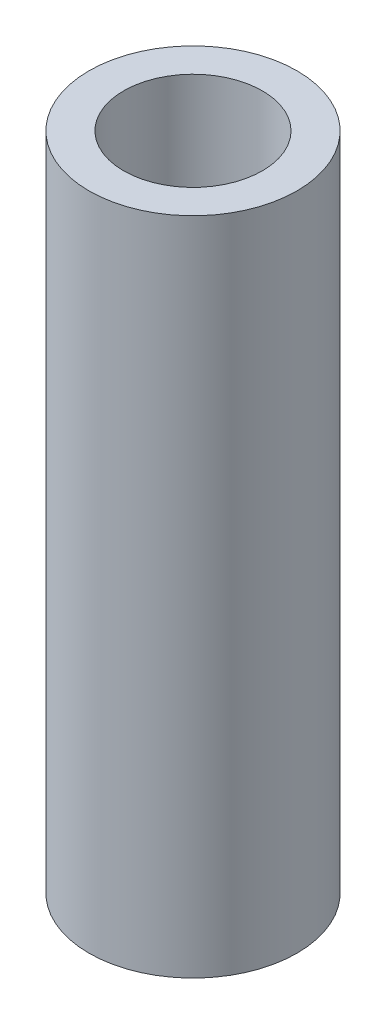
ISO-10303-21;
HEADER;
FILE_DESCRIPTION(('STEP AP214'),'2;1');
FILE_NAME('part.step','',(''),(''),'','','');
FILE_SCHEMA(('AUTOMOTIVE_DESIGN { 1 0 10303 214 1 1 1 1 }'));
ENDSEC;
DATA;
#1=APPLICATION_CONTEXT('core data for automotive mechanical design processes');
#2=APPLICATION_PROTOCOL_DEFINITION('international standard','automotive_design',2000,#1);
#3=PRODUCT_CONTEXT('',#1,'mechanical');
#4=PRODUCT('Part','Part','',(#3));
#5=PRODUCT_RELATED_PRODUCT_CATEGORY('part','',(#4));
#6=PRODUCT_DEFINITION_FORMATION('','',#4);
#7=PRODUCT_DEFINITION_CONTEXT('part definition',#1,'design');
#8=PRODUCT_DEFINITION('design','',#6,#7);
#9=PRODUCT_DEFINITION_SHAPE('','',#8);
#10=(LENGTH_UNIT() NAMED_UNIT(*) SI_UNIT(.MILLI.,.METRE.));
#11=(NAMED_UNIT(*) PLANE_ANGLE_UNIT() SI_UNIT($,.RADIAN.));
#12=(NAMED_UNIT(*) SI_UNIT($,.STERADIAN.) SOLID_ANGLE_UNIT());
#13=UNCERTAINTY_MEASURE_WITH_UNIT(LENGTH_MEASURE(1.E-05),#10,'distance_accuracy_value','');
#14=(GEOMETRIC_REPRESENTATION_CONTEXT(3) GLOBAL_UNCERTAINTY_ASSIGNED_CONTEXT((#13)) GLOBAL_UNIT_ASSIGNED_CONTEXT((#10,
#11,#12)) REPRESENTATION_CONTEXT('',''));
#15=CARTESIAN_POINT('',(0.,0.,0.));
#16=DIRECTION('',(0.,0.,1.));
#17=DIRECTION('',(1.,0.,0.));
#18=AXIS2_PLACEMENT_3D('',#15,#16,#17);
#19=CARTESIAN_POINT('',(0.,30.226,0.));
#20=DIRECTION('',(0.,1.,0.));
#21=DIRECTION('',(0.,0.,1.));
#22=AXIS2_PLACEMENT_3D('',#19,#20,#21);
#23=PLANE('',#22);
#24=CARTESIAN_POINT('',(0.,30.226,0.));
#25=DIRECTION('',(0.,1.,0.));
#26=DIRECTION('',(0.,0.,1.));
#27=AXIS2_PLACEMENT_3D('',#24,#25,#26);
#28=CIRCLE('',#27,4.7625);
#29=CARTESIAN_POINT('',(0.,30.226,4.7625));
#30=VERTEX_POINT('',#29);
#31=EDGE_CURVE('E10',#30,#30,#28,.T.);
#32=ORIENTED_EDGE('',*,*,#31,.T.);
#33=EDGE_LOOP('',(#32));
#34=FACE_BOUND('',#33,.T.);
#35=CARTESIAN_POINT('',(0.,30.226,0.));
#36=DIRECTION('',(0.,1.,0.));
#37=DIRECTION('',(0.,0.,1.));
#38=AXIS2_PLACEMENT_3D('',#35,#36,#37);
#39=CIRCLE('',#38,3.175);
#40=CARTESIAN_POINT('',(0.,30.226,3.175));
#41=VERTEX_POINT('',#40);
#42=EDGE_CURVE('E48',#41,#41,#39,.T.);
#43=ORIENTED_EDGE('',*,*,#42,.F.);
#44=EDGE_LOOP('',(#43));
#45=FACE_BOUND('',#44,.T.);
#46=ADVANCED_FACE('F37',(#34,#45),#23,.T.);
#47=CARTESIAN_POINT('',(0.,0.,0.));
#48=DIRECTION('',(0.,1.,0.));
#49=DIRECTION('',(0.,0.,1.));
#50=AXIS2_PLACEMENT_3D('',#47,#48,#49);
#51=PLANE('',#50);
#52=CARTESIAN_POINT('',(0.,0.,0.));
#53=DIRECTION('',(0.,1.,0.));
#54=DIRECTION('',(0.,0.,1.));
#55=AXIS2_PLACEMENT_3D('',#52,#53,#54);
#56=CIRCLE('',#55,4.7625);
#57=CARTESIAN_POINT('',(0.,0.,4.7625));
#58=VERTEX_POINT('',#57);
#59=EDGE_CURVE('E41',#58,#58,#56,.T.);
#60=ORIENTED_EDGE('',*,*,#59,.F.);
#61=EDGE_LOOP('',(#60));
#62=FACE_BOUND('',#61,.T.);
#63=CARTESIAN_POINT('',(0.,0.,0.));
#64=DIRECTION('',(0.,1.,0.));
#65=DIRECTION('',(0.,0.,1.));
#66=AXIS2_PLACEMENT_3D('',#63,#64,#65);
#67=CIRCLE('',#66,3.175);
#68=CARTESIAN_POINT('',(0.,0.,3.175));
#69=VERTEX_POINT('',#68);
#70=EDGE_CURVE('E50',#69,#69,#67,.T.);
#71=ORIENTED_EDGE('',*,*,#70,.T.);
#72=EDGE_LOOP('',(#71));
#73=FACE_BOUND('',#72,.T.);
#74=ADVANCED_FACE('F60',(#62,#73),#51,.F.);
#75=CARTESIAN_POINT('',(0.,30.226,0.));
#76=DIRECTION('',(0.,-1.,0.));
#77=DIRECTION('',(0.,0.,-1.));
#78=AXIS2_PLACEMENT_3D('',#75,#76,#77);
#79=CYLINDRICAL_SURFACE('',#78,4.7625);
#80=ORIENTED_EDGE('',*,*,#31,.F.);
#81=EDGE_LOOP('',(#80));
#82=FACE_BOUND('',#81,.T.);
#83=ORIENTED_EDGE('',*,*,#59,.T.);
#84=EDGE_LOOP('',(#83));
#85=FACE_BOUND('',#84,.T.);
#86=ADVANCED_FACE('F39',(#82,#85),#79,.T.);
#87=CARTESIAN_POINT('',(0.,30.226,0.));
#88=DIRECTION('',(0.,-1.,0.));
#89=DIRECTION('',(0.,0.,-1.));
#90=AXIS2_PLACEMENT_3D('',#87,#88,#89);
#91=CYLINDRICAL_SURFACE('',#90,3.175);
#92=ORIENTED_EDGE('',*,*,#42,.T.);
#93=EDGE_LOOP('',(#92));
#94=FACE_BOUND('',#93,.T.);
#95=ORIENTED_EDGE('',*,*,#70,.F.);
#96=EDGE_LOOP('',(#95));
#97=FACE_BOUND('',#96,.T.);
#98=ADVANCED_FACE('F56',(#94,#97),#91,.F.);
#99=CLOSED_SHELL('',(#46,#74,#86,#98));
#100=MANIFOLD_SOLID_BREP('B2',#99);
#101=ADVANCED_BREP_SHAPE_REPRESENTATION('',(#18,#100),#14);
#102=SHAPE_DEFINITION_REPRESENTATION(#9,#101);
ENDSEC;
END-ISO-10303-21;
